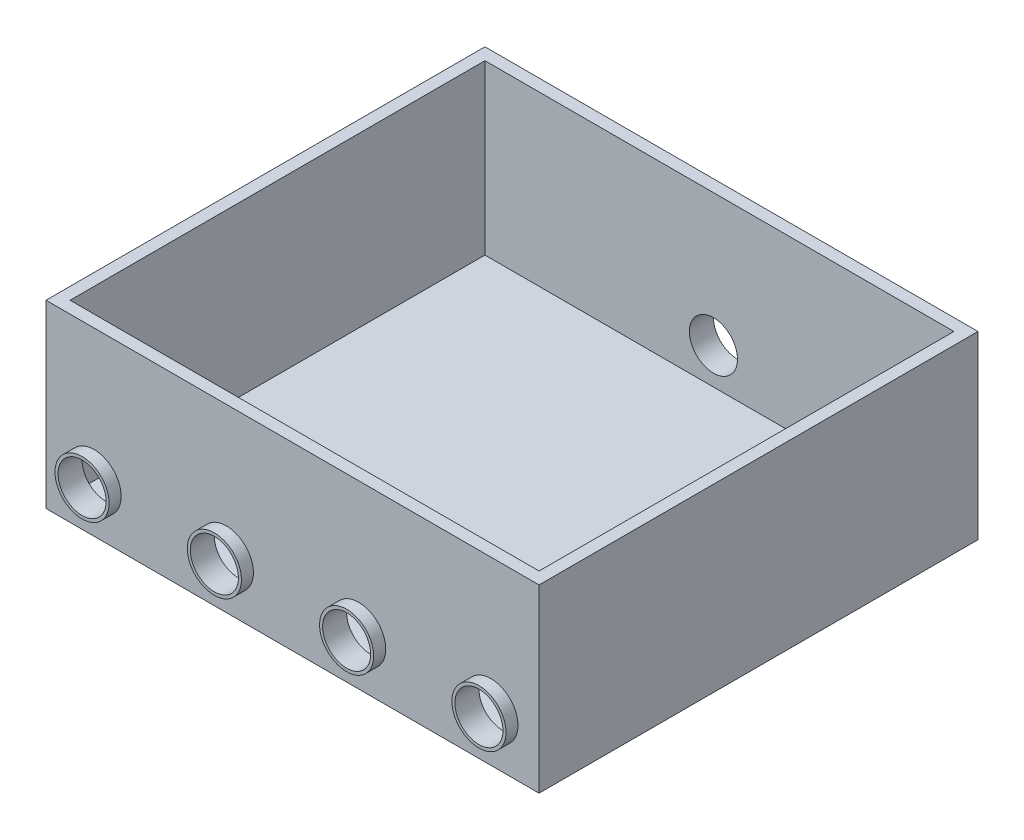
ISO-10303-21;
HEADER;
FILE_DESCRIPTION(('STEP AP214'),'2;1');
FILE_NAME('part.step','',(''),(''),'','','');
FILE_SCHEMA(('AUTOMOTIVE_DESIGN { 1 0 10303 214 1 1 1 1 }'));
ENDSEC;
DATA;
#1=APPLICATION_CONTEXT('core data for automotive mechanical design processes');
#2=APPLICATION_PROTOCOL_DEFINITION('international standard','automotive_design',2000,#1);
#3=PRODUCT_CONTEXT('',#1,'mechanical');
#4=PRODUCT('Part','Part','',(#3));
#5=PRODUCT_RELATED_PRODUCT_CATEGORY('part','',(#4));
#6=PRODUCT_DEFINITION_FORMATION('','',#4);
#7=PRODUCT_DEFINITION_CONTEXT('part definition',#1,'design');
#8=PRODUCT_DEFINITION('design','',#6,#7);
#9=PRODUCT_DEFINITION_SHAPE('','',#8);
#10=(LENGTH_UNIT() NAMED_UNIT(*) SI_UNIT(.MILLI.,.METRE.));
#11=(NAMED_UNIT(*) PLANE_ANGLE_UNIT() SI_UNIT($,.RADIAN.));
#12=(NAMED_UNIT(*) SI_UNIT($,.STERADIAN.) SOLID_ANGLE_UNIT());
#13=UNCERTAINTY_MEASURE_WITH_UNIT(LENGTH_MEASURE(1.E-05),#10,'distance_accuracy_value','');
#14=(GEOMETRIC_REPRESENTATION_CONTEXT(3) GLOBAL_UNCERTAINTY_ASSIGNED_CONTEXT((#13)) GLOBAL_UNIT_ASSIGNED_CONTEXT((#10,
#11,#12)) REPRESENTATION_CONTEXT('',''));
#15=CARTESIAN_POINT('',(0.,0.,0.));
#16=DIRECTION('',(0.,0.,1.));
#17=DIRECTION('',(1.,0.,0.));
#18=AXIS2_PLACEMENT_3D('',#15,#16,#17);
#19=CARTESIAN_POINT('',(0.,508.,0.));
#20=DIRECTION('',(1.,0.,0.));
#21=DIRECTION('',(0.,0.,-1.));
#22=AXIS2_PLACEMENT_3D('',#19,#20,#21);
#23=PLANE('',#22);
#24=DIRECTION('',(0.,-1.,0.));
#25=VECTOR('',#24,1.);
#26=CARTESIAN_POINT('',(0.,508.,0.));
#27=LINE('',#26,#25);
#28=CARTESIAN_POINT('',(0.,381.,0.));
#29=VERTEX_POINT('',#28);
#30=CARTESIAN_POINT('',(0.,0.,0.));
#31=VERTEX_POINT('',#30);
#32=EDGE_CURVE('E119',#29,#31,#27,.T.);
#33=ORIENTED_EDGE('',*,*,#32,.F.);
#34=DIRECTION('',(0.,0.,1.));
#35=VECTOR('',#34,1.);
#36=CARTESIAN_POINT('',(0.,381.,-927.1));
#37=LINE('',#36,#35);
#38=CARTESIAN_POINT('',(0.,381.,-927.1));
#39=VERTEX_POINT('',#38);
#40=EDGE_CURVE('E101',#39,#29,#37,.T.);
#41=ORIENTED_EDGE('',*,*,#40,.F.);
#42=DIRECTION('',(0.,-1.,0.));
#43=VECTOR('',#42,1.);
#44=CARTESIAN_POINT('',(0.,508.,-927.1));
#45=LINE('',#44,#43);
#46=CARTESIAN_POINT('',(0.,0.,-927.1));
#47=VERTEX_POINT('',#46);
#48=EDGE_CURVE('E123',#39,#47,#45,.T.);
#49=ORIENTED_EDGE('',*,*,#48,.T.);
#50=DIRECTION('',(0.,0.,1.));
#51=VECTOR('',#50,1.);
#52=CARTESIAN_POINT('',(0.,0.,0.));
#53=LINE('',#52,#51);
#54=EDGE_CURVE('E217',#47,#31,#53,.T.);
#55=ORIENTED_EDGE('',*,*,#54,.T.);
#56=EDGE_LOOP('',(#33,#41,#49,#55));
#57=FACE_BOUND('',#56,.T.);
#58=ADVANCED_FACE('F37',(#57),#23,.F.);
#59=CARTESIAN_POINT('',(0.,508.,0.));
#60=DIRECTION('',(0.,0.,-1.));
#61=DIRECTION('',(-1.,0.,0.));
#62=AXIS2_PLACEMENT_3D('',#59,#60,#61);
#63=PLANE('',#62);
#64=CARTESIAN_POINT('',(939.8,101.6,0.));
#65=DIRECTION('',(0.,0.,-1.));
#66=DIRECTION('',(-1.,0.,0.));
#67=AXIS2_PLACEMENT_3D('',#64,#65,#66);
#68=CIRCLE('',#67,57.15);
#69=CARTESIAN_POINT('',(882.65,101.6,0.));
#70=VERTEX_POINT('',#69);
#71=EDGE_CURVE('E135',#70,#70,#68,.F.);
#72=ORIENTED_EDGE('',*,*,#71,.F.);
#73=EDGE_LOOP('',(#72));
#74=FACE_BOUND('',#73,.T.);
#75=CARTESIAN_POINT('',(660.4,101.6,0.));
#76=DIRECTION('',(0.,0.,-1.));
#77=DIRECTION('',(-1.,0.,0.));
#78=AXIS2_PLACEMENT_3D('',#75,#76,#77);
#79=CIRCLE('',#78,57.1499999999999);
#80=CARTESIAN_POINT('',(603.25,101.6,0.));
#81=VERTEX_POINT('',#80);
#82=EDGE_CURVE('E132',#81,#81,#79,.F.);
#83=ORIENTED_EDGE('',*,*,#82,.F.);
#84=EDGE_LOOP('',(#83));
#85=FACE_BOUND('',#84,.T.);
#86=CARTESIAN_POINT('',(381.,101.6,0.));
#87=DIRECTION('',(0.,0.,-1.));
#88=DIRECTION('',(-1.,0.,0.));
#89=AXIS2_PLACEMENT_3D('',#86,#87,#88);
#90=CIRCLE('',#89,57.1499999999999);
#91=CARTESIAN_POINT('',(323.85,101.6,0.));
#92=VERTEX_POINT('',#91);
#93=EDGE_CURVE('E129',#92,#92,#90,.F.);
#94=ORIENTED_EDGE('',*,*,#93,.F.);
#95=EDGE_LOOP('',(#94));
#96=FACE_BOUND('',#95,.T.);
#97=CARTESIAN_POINT('',(101.6,101.6,0.));
#98=DIRECTION('',(0.,0.,-1.));
#99=DIRECTION('',(-1.,0.,0.));
#100=AXIS2_PLACEMENT_3D('',#97,#98,#99);
#101=CIRCLE('',#100,57.15);
#102=CARTESIAN_POINT('',(44.4499999999999,101.6,0.));
#103=VERTEX_POINT('',#102);
#104=EDGE_CURVE('E121',#103,#103,#101,.F.);
#105=ORIENTED_EDGE('',*,*,#104,.F.);
#106=EDGE_LOOP('',(#105));
#107=FACE_BOUND('',#106,.T.);
#108=DIRECTION('',(0.,-1.,0.));
#109=VECTOR('',#108,1.);
#110=CARTESIAN_POINT('',(1041.4,508.,0.));
#111=LINE('',#110,#109);
#112=CARTESIAN_POINT('',(1041.4,381.,0.));
#113=VERTEX_POINT('',#112);
#114=CARTESIAN_POINT('',(1041.4,0.,0.));
#115=VERTEX_POINT('',#114);
#116=EDGE_CURVE('E111',#113,#115,#111,.T.);
#117=ORIENTED_EDGE('',*,*,#116,.F.);
#118=DIRECTION('',(-1.,0.,0.));
#119=VECTOR('',#118,1.);
#120=CARTESIAN_POINT('',(1041.4,381.,0.));
#121=LINE('',#120,#119);
#122=EDGE_CURVE('E98',#113,#29,#121,.T.);
#123=ORIENTED_EDGE('',*,*,#122,.T.);
#124=ORIENTED_EDGE('',*,*,#32,.T.);
#125=DIRECTION('',(1.,0.,0.));
#126=VECTOR('',#125,1.);
#127=CARTESIAN_POINT('',(0.,0.,0.));
#128=LINE('',#127,#126);
#129=EDGE_CURVE('E117',#31,#115,#128,.T.);
#130=ORIENTED_EDGE('',*,*,#129,.T.);
#131=EDGE_LOOP('',(#117,#123,#124,#130));
#132=FACE_BOUND('',#131,.T.);
#133=ADVANCED_FACE('F115',(#74,#85,#96,#107,#132),#63,.F.);
#134=CARTESIAN_POINT('',(1041.4,508.,0.));
#135=DIRECTION('',(-1.,0.,0.));
#136=DIRECTION('',(0.,0.,1.));
#137=AXIS2_PLACEMENT_3D('',#134,#135,#136);
#138=PLANE('',#137);
#139=DIRECTION('',(0.,-1.,0.));
#140=VECTOR('',#139,1.);
#141=CARTESIAN_POINT('',(1041.4,508.,-927.1));
#142=LINE('',#141,#140);
#143=CARTESIAN_POINT('',(1041.4,381.,-927.1));
#144=VERTEX_POINT('',#143);
#145=CARTESIAN_POINT('',(1041.4,0.,-927.1));
#146=VERTEX_POINT('',#145);
#147=EDGE_CURVE('E113',#144,#146,#142,.T.);
#148=ORIENTED_EDGE('',*,*,#147,.F.);
#149=DIRECTION('',(0.,0.,1.));
#150=VECTOR('',#149,1.);
#151=CARTESIAN_POINT('',(1041.4,381.,-927.1));
#152=LINE('',#151,#150);
#153=EDGE_CURVE('E51',#144,#113,#152,.T.);
#154=ORIENTED_EDGE('',*,*,#153,.T.);
#155=ORIENTED_EDGE('',*,*,#116,.T.);
#156=DIRECTION('',(0.,0.,-1.));
#157=VECTOR('',#156,1.);
#158=CARTESIAN_POINT('',(1041.4,0.,0.));
#159=LINE('',#158,#157);
#160=EDGE_CURVE('E221',#115,#146,#159,.T.);
#161=ORIENTED_EDGE('',*,*,#160,.T.);
#162=EDGE_LOOP('',(#148,#154,#155,#161));
#163=FACE_BOUND('',#162,.T.);
#164=ADVANCED_FACE('F109',(#163),#138,.F.);
#165=CARTESIAN_POINT('',(0.,508.,-927.1));
#166=DIRECTION('',(0.,0.,1.));
#167=DIRECTION('',(1.,0.,0.));
#168=AXIS2_PLACEMENT_3D('',#165,#166,#167);
#169=PLANE('',#168);
#170=CARTESIAN_POINT('',(508.,101.6,-927.1));
#171=DIRECTION('',(0.,0.,1.));
#172=DIRECTION('',(1.,0.,0.));
#173=AXIS2_PLACEMENT_3D('',#170,#171,#172);
#174=CIRCLE('',#173,57.1499999999999);
#175=CARTESIAN_POINT('',(565.15,101.6,-927.1));
#176=VERTEX_POINT('',#175);
#177=EDGE_CURVE('E44',#176,#176,#174,.F.);
#178=ORIENTED_EDGE('',*,*,#177,.F.);
#179=EDGE_LOOP('',(#178));
#180=FACE_BOUND('',#179,.T.);
#181=ORIENTED_EDGE('',*,*,#48,.F.);
#182=DIRECTION('',(-1.,0.,0.));
#183=VECTOR('',#182,1.);
#184=CARTESIAN_POINT('',(1041.4,381.,-927.1));
#185=LINE('',#184,#183);
#186=EDGE_CURVE('E105',#144,#39,#185,.T.);
#187=ORIENTED_EDGE('',*,*,#186,.F.);
#188=ORIENTED_EDGE('',*,*,#147,.T.);
#189=DIRECTION('',(-1.,0.,0.));
#190=VECTOR('',#189,1.);
#191=CARTESIAN_POINT('',(0.,0.,-927.1));
#192=LINE('',#191,#190);
#193=EDGE_CURVE('E223',#146,#47,#192,.T.);
#194=ORIENTED_EDGE('',*,*,#193,.T.);
#195=EDGE_LOOP('',(#181,#187,#188,#194));
#196=FACE_BOUND('',#195,.T.);
#197=ADVANCED_FACE('F230',(#180,#196),#169,.F.);
#198=CARTESIAN_POINT('',(0.,0.,0.));
#199=DIRECTION('',(0.,-1.,0.));
#200=DIRECTION('',(0.,0.,-1.));
#201=AXIS2_PLACEMENT_3D('',#198,#199,#200);
#202=PLANE('',#201);
#203=ORIENTED_EDGE('',*,*,#54,.F.);
#204=ORIENTED_EDGE('',*,*,#193,.F.);
#205=ORIENTED_EDGE('',*,*,#160,.F.);
#206=ORIENTED_EDGE('',*,*,#129,.F.);
#207=EDGE_LOOP('',(#203,#204,#205,#206));
#208=FACE_BOUND('',#207,.T.);
#209=ADVANCED_FACE('F232',(#208),#202,.T.);
#210=CARTESIAN_POINT('',(101.6,101.6,25.4));
#211=DIRECTION('',(0.,0.,-1.));
#212=DIRECTION('',(-1.,0.,0.));
#213=AXIS2_PLACEMENT_3D('',#210,#211,#212);
#214=CYLINDRICAL_SURFACE('',#213,57.15);
#215=CARTESIAN_POINT('',(101.6,101.6,25.4));
#216=DIRECTION('',(0.,0.,1.));
#217=DIRECTION('',(1.,0.,0.));
#218=AXIS2_PLACEMENT_3D('',#215,#216,#217);
#219=CIRCLE('',#218,57.15);
#220=CARTESIAN_POINT('',(158.75,101.6,25.4));
#221=VERTEX_POINT('',#220);
#222=EDGE_CURVE('E214',#221,#221,#219,.T.);
#223=ORIENTED_EDGE('',*,*,#222,.F.);
#224=EDGE_LOOP('',(#223));
#225=FACE_BOUND('',#224,.T.);
#226=ORIENTED_EDGE('',*,*,#104,.T.);
#227=EDGE_LOOP('',(#226));
#228=FACE_BOUND('',#227,.T.);
#229=ADVANCED_FACE('F234',(#225,#228),#214,.T.);
#230=CARTESIAN_POINT('',(101.6,101.6,25.4));
#231=DIRECTION('',(0.,0.,1.));
#232=DIRECTION('',(1.,0.,0.));
#233=AXIS2_PLACEMENT_3D('',#230,#231,#232);
#234=PLANE('',#233);
#235=CARTESIAN_POINT('',(101.6,101.6,25.4));
#236=DIRECTION('',(0.,0.,1.));
#237=DIRECTION('',(1.,0.,0.));
#238=AXIS2_PLACEMENT_3D('',#235,#236,#237);
#239=CIRCLE('',#238,50.8);
#240=CARTESIAN_POINT('',(152.4,101.6,25.4));
#241=VERTEX_POINT('',#240);
#242=EDGE_CURVE('E144',#241,#241,#239,.T.);
#243=ORIENTED_EDGE('',*,*,#242,.F.);
#244=EDGE_LOOP('',(#243));
#245=FACE_BOUND('',#244,.T.);
#246=ORIENTED_EDGE('',*,*,#222,.T.);
#247=EDGE_LOOP('',(#246));
#248=FACE_BOUND('',#247,.T.);
#249=ADVANCED_FACE('F240',(#245,#248),#234,.T.);
#250=CARTESIAN_POINT('',(381.,101.6,25.4));
#251=DIRECTION('',(0.,0.,-1.));
#252=DIRECTION('',(-1.,0.,0.));
#253=AXIS2_PLACEMENT_3D('',#250,#251,#252);
#254=CYLINDRICAL_SURFACE('',#253,57.1499999999999);
#255=CARTESIAN_POINT('',(381.,101.6,25.4));
#256=DIRECTION('',(0.,0.,1.));
#257=DIRECTION('',(1.,0.,0.));
#258=AXIS2_PLACEMENT_3D('',#255,#256,#257);
#259=CIRCLE('',#258,57.1499999999999);
#260=CARTESIAN_POINT('',(438.15,101.6,25.4));
#261=VERTEX_POINT('',#260);
#262=EDGE_CURVE('E211',#261,#261,#259,.T.);
#263=ORIENTED_EDGE('',*,*,#262,.F.);
#264=EDGE_LOOP('',(#263));
#265=FACE_BOUND('',#264,.T.);
#266=ORIENTED_EDGE('',*,*,#93,.T.);
#267=EDGE_LOOP('',(#266));
#268=FACE_BOUND('',#267,.T.);
#269=ADVANCED_FACE('F268',(#265,#268),#254,.T.);
#270=CARTESIAN_POINT('',(381.,101.6,25.4));
#271=DIRECTION('',(0.,0.,1.));
#272=DIRECTION('',(1.,0.,0.));
#273=AXIS2_PLACEMENT_3D('',#270,#271,#272);
#274=PLANE('',#273);
#275=CARTESIAN_POINT('',(381.,101.6,25.4));
#276=DIRECTION('',(0.,0.,1.));
#277=DIRECTION('',(1.,0.,0.));
#278=AXIS2_PLACEMENT_3D('',#275,#276,#277);
#279=CIRCLE('',#278,50.8);
#280=CARTESIAN_POINT('',(431.8,101.6,25.4));
#281=VERTEX_POINT('',#280);
#282=EDGE_CURVE('E174',#281,#281,#279,.T.);
#283=ORIENTED_EDGE('',*,*,#282,.F.);
#284=EDGE_LOOP('',(#283));
#285=FACE_BOUND('',#284,.T.);
#286=ORIENTED_EDGE('',*,*,#262,.T.);
#287=EDGE_LOOP('',(#286));
#288=FACE_BOUND('',#287,.T.);
#289=ADVANCED_FACE('F270',(#285,#288),#274,.T.);
#290=CARTESIAN_POINT('',(660.4,101.6,25.4));
#291=DIRECTION('',(0.,0.,-1.));
#292=DIRECTION('',(-1.,0.,0.));
#293=AXIS2_PLACEMENT_3D('',#290,#291,#292);
#294=CYLINDRICAL_SURFACE('',#293,57.1499999999999);
#295=CARTESIAN_POINT('',(660.4,101.6,25.4));
#296=DIRECTION('',(0.,0.,1.));
#297=DIRECTION('',(1.,0.,0.));
#298=AXIS2_PLACEMENT_3D('',#295,#296,#297);
#299=CIRCLE('',#298,57.1499999999999);
#300=CARTESIAN_POINT('',(717.55,101.6,25.4));
#301=VERTEX_POINT('',#300);
#302=EDGE_CURVE('E208',#301,#301,#299,.T.);
#303=ORIENTED_EDGE('',*,*,#302,.F.);
#304=EDGE_LOOP('',(#303));
#305=FACE_BOUND('',#304,.T.);
#306=ORIENTED_EDGE('',*,*,#82,.T.);
#307=EDGE_LOOP('',(#306));
#308=FACE_BOUND('',#307,.T.);
#309=ADVANCED_FACE('F277',(#305,#308),#294,.T.);
#310=CARTESIAN_POINT('',(660.4,101.6,25.4));
#311=DIRECTION('',(0.,0.,1.));
#312=DIRECTION('',(1.,0.,0.));
#313=AXIS2_PLACEMENT_3D('',#310,#311,#312);
#314=PLANE('',#313);
#315=CARTESIAN_POINT('',(660.4,101.6,25.4));
#316=DIRECTION('',(0.,0.,1.));
#317=DIRECTION('',(1.,0.,0.));
#318=AXIS2_PLACEMENT_3D('',#315,#316,#317);
#319=CIRCLE('',#318,50.8);
#320=CARTESIAN_POINT('',(711.2,101.6,25.4));
#321=VERTEX_POINT('',#320);
#322=EDGE_CURVE('E160',#321,#321,#319,.T.);
#323=ORIENTED_EDGE('',*,*,#322,.F.);
#324=EDGE_LOOP('',(#323));
#325=FACE_BOUND('',#324,.T.);
#326=ORIENTED_EDGE('',*,*,#302,.T.);
#327=EDGE_LOOP('',(#326));
#328=FACE_BOUND('',#327,.T.);
#329=ADVANCED_FACE('F286',(#325,#328),#314,.T.);
#330=CARTESIAN_POINT('',(939.8,101.6,25.4));
#331=DIRECTION('',(0.,0.,-1.));
#332=DIRECTION('',(-1.,0.,0.));
#333=AXIS2_PLACEMENT_3D('',#330,#331,#332);
#334=CYLINDRICAL_SURFACE('',#333,57.15);
#335=CARTESIAN_POINT('',(939.8,101.6,25.4));
#336=DIRECTION('',(0.,0.,1.));
#337=DIRECTION('',(1.,0.,0.));
#338=AXIS2_PLACEMENT_3D('',#335,#336,#337);
#339=CIRCLE('',#338,57.15);
#340=CARTESIAN_POINT('',(996.95,101.6,25.4));
#341=VERTEX_POINT('',#340);
#342=EDGE_CURVE('E205',#341,#341,#339,.T.);
#343=ORIENTED_EDGE('',*,*,#342,.F.);
#344=EDGE_LOOP('',(#343));
#345=FACE_BOUND('',#344,.T.);
#346=ORIENTED_EDGE('',*,*,#71,.T.);
#347=EDGE_LOOP('',(#346));
#348=FACE_BOUND('',#347,.T.);
#349=ADVANCED_FACE('F290',(#345,#348),#334,.T.);
#350=CARTESIAN_POINT('',(939.8,101.6,25.4));
#351=DIRECTION('',(0.,0.,1.));
#352=DIRECTION('',(1.,0.,0.));
#353=AXIS2_PLACEMENT_3D('',#350,#351,#352);
#354=PLANE('',#353);
#355=CARTESIAN_POINT('',(939.8,101.6,25.4));
#356=DIRECTION('',(0.,0.,1.));
#357=DIRECTION('',(1.,0.,0.));
#358=AXIS2_PLACEMENT_3D('',#355,#356,#357);
#359=CIRCLE('',#358,50.8);
#360=CARTESIAN_POINT('',(990.6,101.6,25.4));
#361=VERTEX_POINT('',#360);
#362=EDGE_CURVE('E155',#361,#361,#359,.T.);
#363=ORIENTED_EDGE('',*,*,#362,.F.);
#364=EDGE_LOOP('',(#363));
#365=FACE_BOUND('',#364,.T.);
#366=ORIENTED_EDGE('',*,*,#342,.T.);
#367=EDGE_LOOP('',(#366));
#368=FACE_BOUND('',#367,.T.);
#369=ADVANCED_FACE('F294',(#365,#368),#354,.T.);
#370=CARTESIAN_POINT('',(508.,101.6,-952.5));
#371=DIRECTION('',(0.,0.,1.));
#372=DIRECTION('',(1.,0.,0.));
#373=AXIS2_PLACEMENT_3D('',#370,#371,#372);
#374=CYLINDRICAL_SURFACE('',#373,57.1499999999999);
#375=CARTESIAN_POINT('',(508.,101.6,-952.5));
#376=DIRECTION('',(0.,0.,-1.));
#377=DIRECTION('',(-1.,0.,0.));
#378=AXIS2_PLACEMENT_3D('',#375,#376,#377);
#379=CIRCLE('',#378,57.1499999999999);
#380=CARTESIAN_POINT('',(450.85,101.6,-952.5));
#381=VERTEX_POINT('',#380);
#382=EDGE_CURVE('E194',#381,#381,#379,.T.);
#383=ORIENTED_EDGE('',*,*,#382,.F.);
#384=EDGE_LOOP('',(#383));
#385=FACE_BOUND('',#384,.T.);
#386=ORIENTED_EDGE('',*,*,#177,.T.);
#387=EDGE_LOOP('',(#386));
#388=FACE_BOUND('',#387,.T.);
#389=ADVANCED_FACE('F298',(#385,#388),#374,.T.);
#390=CARTESIAN_POINT('',(508.,101.6,-952.5));
#391=DIRECTION('',(0.,0.,-1.));
#392=DIRECTION('',(-1.,0.,0.));
#393=AXIS2_PLACEMENT_3D('',#390,#391,#392);
#394=PLANE('',#393);
#395=CARTESIAN_POINT('',(508.,101.6,-952.5));
#396=DIRECTION('',(0.,0.,-1.));
#397=DIRECTION('',(-1.,0.,0.));
#398=AXIS2_PLACEMENT_3D('',#395,#396,#397);
#399=CIRCLE('',#398,50.8);
#400=CARTESIAN_POINT('',(457.2,101.6,-952.5));
#401=VERTEX_POINT('',#400);
#402=EDGE_CURVE('E156',#401,#401,#399,.T.);
#403=ORIENTED_EDGE('',*,*,#402,.F.);
#404=EDGE_LOOP('',(#403));
#405=FACE_BOUND('',#404,.T.);
#406=ORIENTED_EDGE('',*,*,#382,.T.);
#407=EDGE_LOOP('',(#406));
#408=FACE_BOUND('',#407,.T.);
#409=ADVANCED_FACE('F302',(#405,#408),#394,.T.);
#410=CARTESIAN_POINT('',(1016.,25.4,-901.7));
#411=DIRECTION('',(1.,0.,0.));
#412=DIRECTION('',(0.,0.,-1.));
#413=AXIS2_PLACEMENT_3D('',#410,#411,#412);
#414=PLANE('',#413);
#415=DIRECTION('',(0.,1.,0.));
#416=VECTOR('',#415,1.);
#417=CARTESIAN_POINT('',(1016.,25.4,-25.4));
#418=LINE('',#417,#416);
#419=CARTESIAN_POINT('',(1016.,25.4,-25.4));
#420=VERTEX_POINT('',#419);
#421=CARTESIAN_POINT('',(1016.,381.,-25.4));
#422=VERTEX_POINT('',#421);
#423=EDGE_CURVE('E191',#420,#422,#418,.T.);
#424=ORIENTED_EDGE('',*,*,#423,.T.);
#425=DIRECTION('',(0.,0.,-1.));
#426=VECTOR('',#425,1.);
#427=CARTESIAN_POINT('',(1016.,381.,-901.7));
#428=LINE('',#427,#426);
#429=CARTESIAN_POINT('',(1016.,381.,-901.7));
#430=VERTEX_POINT('',#429);
#431=EDGE_CURVE('E163',#422,#430,#428,.T.);
#432=ORIENTED_EDGE('',*,*,#431,.T.);
#433=DIRECTION('',(0.,1.,0.));
#434=VECTOR('',#433,1.);
#435=CARTESIAN_POINT('',(1016.,25.4,-901.7));
#436=LINE('',#435,#434);
#437=CARTESIAN_POINT('',(1016.,25.4,-901.7));
#438=VERTEX_POINT('',#437);
#439=EDGE_CURVE('E190',#438,#430,#436,.T.);
#440=ORIENTED_EDGE('',*,*,#439,.F.);
#441=DIRECTION('',(0.,0.,-1.));
#442=VECTOR('',#441,1.);
#443=CARTESIAN_POINT('',(1016.,25.4,-901.7));
#444=LINE('',#443,#442);
#445=EDGE_CURVE('E152',#420,#438,#444,.T.);
#446=ORIENTED_EDGE('',*,*,#445,.F.);
#447=EDGE_LOOP('',(#424,#432,#440,#446));
#448=FACE_BOUND('',#447,.T.);
#449=ADVANCED_FACE('F306',(#448),#414,.F.);
#450=CARTESIAN_POINT('',(1016.,25.4,-25.4));
#451=DIRECTION('',(0.,0.,1.));
#452=DIRECTION('',(1.,0.,0.));
#453=AXIS2_PLACEMENT_3D('',#450,#451,#452);
#454=PLANE('',#453);
#455=CARTESIAN_POINT('',(101.6,101.6,-25.3999999999999));
#456=DIRECTION('',(0.,0.,1.));
#457=DIRECTION('',(1.,0.,0.));
#458=AXIS2_PLACEMENT_3D('',#455,#456,#457);
#459=CIRCLE('',#458,50.8);
#460=CARTESIAN_POINT('',(152.4,101.6,-25.3999999999999));
#461=VERTEX_POINT('',#460);
#462=EDGE_CURVE('E150',#461,#461,#459,.T.);
#463=ORIENTED_EDGE('',*,*,#462,.T.);
#464=EDGE_LOOP('',(#463));
#465=FACE_BOUND('',#464,.T.);
#466=CARTESIAN_POINT('',(381.,101.6,-25.3999999999999));
#467=DIRECTION('',(0.,0.,1.));
#468=DIRECTION('',(1.,0.,0.));
#469=AXIS2_PLACEMENT_3D('',#466,#467,#468);
#470=CIRCLE('',#469,50.8);
#471=CARTESIAN_POINT('',(431.8,101.6,-25.3999999999999));
#472=VERTEX_POINT('',#471);
#473=EDGE_CURVE('E147',#472,#472,#470,.T.);
#474=ORIENTED_EDGE('',*,*,#473,.T.);
#475=EDGE_LOOP('',(#474));
#476=FACE_BOUND('',#475,.T.);
#477=CARTESIAN_POINT('',(660.4,101.6,-25.4));
#478=DIRECTION('',(0.,0.,1.));
#479=DIRECTION('',(1.,0.,0.));
#480=AXIS2_PLACEMENT_3D('',#477,#478,#479);
#481=CIRCLE('',#480,50.8);
#482=CARTESIAN_POINT('',(711.2,101.6,-25.4));
#483=VERTEX_POINT('',#482);
#484=EDGE_CURVE('E143',#483,#483,#481,.T.);
#485=ORIENTED_EDGE('',*,*,#484,.T.);
#486=EDGE_LOOP('',(#485));
#487=FACE_BOUND('',#486,.T.);
#488=CARTESIAN_POINT('',(939.8,101.6,-25.4));
#489=DIRECTION('',(0.,0.,1.));
#490=DIRECTION('',(1.,0.,0.));
#491=AXIS2_PLACEMENT_3D('',#488,#489,#490);
#492=CIRCLE('',#491,50.8);
#493=CARTESIAN_POINT('',(990.6,101.6,-25.4));
#494=VERTEX_POINT('',#493);
#495=EDGE_CURVE('E140',#494,#494,#492,.T.);
#496=ORIENTED_EDGE('',*,*,#495,.T.);
#497=EDGE_LOOP('',(#496));
#498=FACE_BOUND('',#497,.T.);
#499=DIRECTION('',(0.,1.,0.));
#500=VECTOR('',#499,1.);
#501=CARTESIAN_POINT('',(25.4000000000001,25.4,-25.3999999999999));
#502=LINE('',#501,#500);
#503=CARTESIAN_POINT('',(25.4000000000001,25.4,-25.3999999999999));
#504=VERTEX_POINT('',#503);
#505=CARTESIAN_POINT('',(25.4000000000001,381.,-25.3999999999999));
#506=VERTEX_POINT('',#505);
#507=EDGE_CURVE('E195',#504,#506,#502,.T.);
#508=ORIENTED_EDGE('',*,*,#507,.T.);
#509=DIRECTION('',(1.,0.,0.));
#510=VECTOR('',#509,1.);
#511=CARTESIAN_POINT('',(1016.,381.,-25.4));
#512=LINE('',#511,#510);
#513=EDGE_CURVE('E168',#506,#422,#512,.T.);
#514=ORIENTED_EDGE('',*,*,#513,.T.);
#515=ORIENTED_EDGE('',*,*,#423,.F.);
#516=DIRECTION('',(1.,0.,0.));
#517=VECTOR('',#516,1.);
#518=CARTESIAN_POINT('',(1016.,25.4,-25.4));
#519=LINE('',#518,#517);
#520=EDGE_CURVE('E187',#504,#420,#519,.T.);
#521=ORIENTED_EDGE('',*,*,#520,.F.);
#522=EDGE_LOOP('',(#508,#514,#515,#521));
#523=FACE_BOUND('',#522,.T.);
#524=ADVANCED_FACE('F309',(#465,#476,#487,#498,#523),#454,.F.);
#525=CARTESIAN_POINT('',(25.4,25.4,-901.7));
#526=DIRECTION('',(-1.,0.,0.));
#527=DIRECTION('',(0.,0.,1.));
#528=AXIS2_PLACEMENT_3D('',#525,#526,#527);
#529=PLANE('',#528);
#530=DIRECTION('',(0.,1.,0.));
#531=VECTOR('',#530,1.);
#532=CARTESIAN_POINT('',(25.4,25.4,-901.7));
#533=LINE('',#532,#531);
#534=CARTESIAN_POINT('',(25.4,25.4,-901.7));
#535=VERTEX_POINT('',#534);
#536=CARTESIAN_POINT('',(25.4,381.,-901.7));
#537=VERTEX_POINT('',#536);
#538=EDGE_CURVE('E198',#535,#537,#533,.T.);
#539=ORIENTED_EDGE('',*,*,#538,.T.);
#540=DIRECTION('',(0.,0.,1.));
#541=VECTOR('',#540,1.);
#542=CARTESIAN_POINT('',(25.4,381.,-901.7));
#543=LINE('',#542,#541);
#544=EDGE_CURVE('E59',#537,#506,#543,.T.);
#545=ORIENTED_EDGE('',*,*,#544,.T.);
#546=ORIENTED_EDGE('',*,*,#507,.F.);
#547=DIRECTION('',(0.,0.,1.));
#548=VECTOR('',#547,1.);
#549=CARTESIAN_POINT('',(25.4,25.4,-901.7));
#550=LINE('',#549,#548);
#551=EDGE_CURVE('E184',#535,#504,#550,.T.);
#552=ORIENTED_EDGE('',*,*,#551,.F.);
#553=EDGE_LOOP('',(#539,#545,#546,#552));
#554=FACE_BOUND('',#553,.T.);
#555=ADVANCED_FACE('F315',(#554),#529,.F.);
#556=CARTESIAN_POINT('',(1016.,25.4,-901.7));
#557=DIRECTION('',(0.,0.,-1.));
#558=DIRECTION('',(-1.,0.,0.));
#559=AXIS2_PLACEMENT_3D('',#556,#557,#558);
#560=PLANE('',#559);
#561=CARTESIAN_POINT('',(508.,101.6,-901.7));
#562=DIRECTION('',(0.,0.,-1.));
#563=DIRECTION('',(-1.,0.,0.));
#564=AXIS2_PLACEMENT_3D('',#561,#562,#563);
#565=CIRCLE('',#564,50.8);
#566=CARTESIAN_POINT('',(457.2,101.6,-901.7));
#567=VERTEX_POINT('',#566);
#568=EDGE_CURVE('E153',#567,#567,#565,.T.);
#569=ORIENTED_EDGE('',*,*,#568,.T.);
#570=EDGE_LOOP('',(#569));
#571=FACE_BOUND('',#570,.T.);
#572=ORIENTED_EDGE('',*,*,#439,.T.);
#573=DIRECTION('',(-1.,0.,0.));
#574=VECTOR('',#573,1.);
#575=CARTESIAN_POINT('',(1016.,381.,-901.7));
#576=LINE('',#575,#574);
#577=EDGE_CURVE('E11',#430,#537,#576,.T.);
#578=ORIENTED_EDGE('',*,*,#577,.T.);
#579=ORIENTED_EDGE('',*,*,#538,.F.);
#580=DIRECTION('',(-1.,0.,0.));
#581=VECTOR('',#580,1.);
#582=CARTESIAN_POINT('',(1016.,25.4,-901.7));
#583=LINE('',#582,#581);
#584=EDGE_CURVE('E181',#438,#535,#583,.T.);
#585=ORIENTED_EDGE('',*,*,#584,.F.);
#586=EDGE_LOOP('',(#572,#578,#579,#585));
#587=FACE_BOUND('',#586,.T.);
#588=ADVANCED_FACE('F311',(#571,#587),#560,.F.);
#589=CARTESIAN_POINT('',(0.,25.4,0.));
#590=DIRECTION('',(0.,-1.,0.));
#591=DIRECTION('',(0.,0.,-1.));
#592=AXIS2_PLACEMENT_3D('',#589,#590,#591);
#593=PLANE('',#592);
#594=ORIENTED_EDGE('',*,*,#445,.T.);
#595=ORIENTED_EDGE('',*,*,#584,.T.);
#596=ORIENTED_EDGE('',*,*,#551,.T.);
#597=ORIENTED_EDGE('',*,*,#520,.T.);
#598=EDGE_LOOP('',(#594,#595,#596,#597));
#599=FACE_BOUND('',#598,.T.);
#600=ADVANCED_FACE('F314',(#599),#593,.F.);
#601=CARTESIAN_POINT('',(939.8,101.6,-101.6));
#602=DIRECTION('',(0.,0.,1.));
#603=DIRECTION('',(1.,0.,0.));
#604=AXIS2_PLACEMENT_3D('',#601,#602,#603);
#605=CYLINDRICAL_SURFACE('',#604,50.8);
#606=ORIENTED_EDGE('',*,*,#362,.T.);
#607=EDGE_LOOP('',(#606));
#608=FACE_BOUND('',#607,.T.);
#609=ORIENTED_EDGE('',*,*,#495,.F.);
#610=EDGE_LOOP('',(#609));
#611=FACE_BOUND('',#610,.T.);
#612=ADVANCED_FACE('F322',(#608,#611),#605,.F.);
#613=CARTESIAN_POINT('',(660.4,101.6,-101.6));
#614=DIRECTION('',(0.,0.,1.));
#615=DIRECTION('',(1.,0.,0.));
#616=AXIS2_PLACEMENT_3D('',#613,#614,#615);
#617=CYLINDRICAL_SURFACE('',#616,50.8);
#618=ORIENTED_EDGE('',*,*,#322,.T.);
#619=EDGE_LOOP('',(#618));
#620=FACE_BOUND('',#619,.T.);
#621=ORIENTED_EDGE('',*,*,#484,.F.);
#622=EDGE_LOOP('',(#621));
#623=FACE_BOUND('',#622,.T.);
#624=ADVANCED_FACE('F326',(#620,#623),#617,.F.);
#625=CARTESIAN_POINT('',(381.,101.6,-101.6));
#626=DIRECTION('',(0.,0.,1.));
#627=DIRECTION('',(1.,0.,0.));
#628=AXIS2_PLACEMENT_3D('',#625,#626,#627);
#629=CYLINDRICAL_SURFACE('',#628,50.8);
#630=ORIENTED_EDGE('',*,*,#282,.T.);
#631=EDGE_LOOP('',(#630));
#632=FACE_BOUND('',#631,.T.);
#633=ORIENTED_EDGE('',*,*,#473,.F.);
#634=EDGE_LOOP('',(#633));
#635=FACE_BOUND('',#634,.T.);
#636=ADVANCED_FACE('F330',(#632,#635),#629,.F.);
#637=CARTESIAN_POINT('',(101.6,101.6,-101.6));
#638=DIRECTION('',(0.,0.,1.));
#639=DIRECTION('',(1.,0.,0.));
#640=AXIS2_PLACEMENT_3D('',#637,#638,#639);
#641=CYLINDRICAL_SURFACE('',#640,50.8);
#642=ORIENTED_EDGE('',*,*,#242,.T.);
#643=EDGE_LOOP('',(#642));
#644=FACE_BOUND('',#643,.T.);
#645=ORIENTED_EDGE('',*,*,#462,.F.);
#646=EDGE_LOOP('',(#645));
#647=FACE_BOUND('',#646,.T.);
#648=ADVANCED_FACE('F334',(#644,#647),#641,.F.);
#649=CARTESIAN_POINT('',(508.,101.6,-825.5));
#650=DIRECTION('',(0.,0.,-1.));
#651=DIRECTION('',(-1.,0.,0.));
#652=AXIS2_PLACEMENT_3D('',#649,#650,#651);
#653=CYLINDRICAL_SURFACE('',#652,50.8);
#654=ORIENTED_EDGE('',*,*,#402,.T.);
#655=EDGE_LOOP('',(#654));
#656=FACE_BOUND('',#655,.T.);
#657=ORIENTED_EDGE('',*,*,#568,.F.);
#658=EDGE_LOOP('',(#657));
#659=FACE_BOUND('',#658,.T.);
#660=ADVANCED_FACE('F338',(#656,#659),#653,.F.);
#661=CARTESIAN_POINT('',(1041.4,381.,-927.1));
#662=DIRECTION('',(0.,-1.,0.));
#663=DIRECTION('',(0.,0.,-1.));
#664=AXIS2_PLACEMENT_3D('',#661,#662,#663);
#665=PLANE('',#664);
#666=ORIENTED_EDGE('',*,*,#40,.T.);
#667=ORIENTED_EDGE('',*,*,#122,.F.);
#668=ORIENTED_EDGE('',*,*,#153,.F.);
#669=ORIENTED_EDGE('',*,*,#186,.T.);
#670=EDGE_LOOP('',(#666,#667,#668,#669));
#671=FACE_BOUND('',#670,.T.);
#672=ORIENTED_EDGE('',*,*,#513,.F.);
#673=ORIENTED_EDGE('',*,*,#544,.F.);
#674=ORIENTED_EDGE('',*,*,#577,.F.);
#675=ORIENTED_EDGE('',*,*,#431,.F.);
#676=EDGE_LOOP('',(#672,#673,#674,#675));
#677=FACE_BOUND('',#676,.T.);
#678=ADVANCED_FACE('F99',(#671,#677),#665,.F.);
#679=CLOSED_SHELL('',(#58,#133,#164,#197,#209,#229,#249,#269,#289,#309,#329,#349,#369,#389,#409,
#449,#524,#555,#588,#600,#612,#624,#636,#648,#660,#678));
#680=MANIFOLD_SOLID_BREP('B2',#679);
#681=ADVANCED_BREP_SHAPE_REPRESENTATION('',(#18,#680),#14);
#682=SHAPE_DEFINITION_REPRESENTATION(#9,#681);
ENDSEC;
END-ISO-10303-21;
